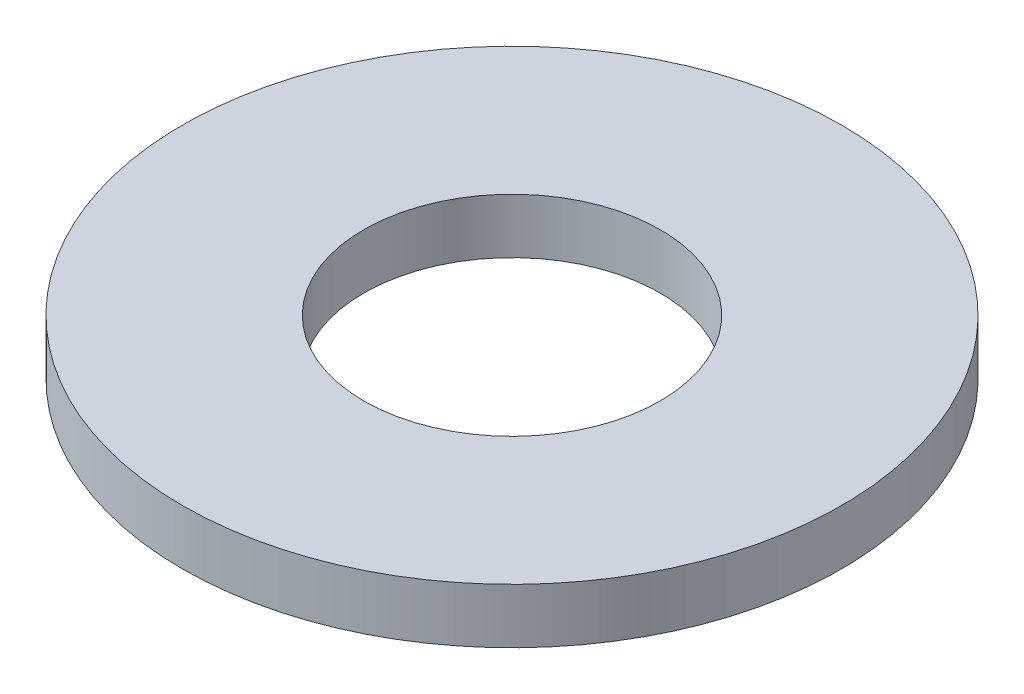
ISO-10303-21;
HEADER;
FILE_DESCRIPTION(('STEP AP214'),'2;1');
FILE_NAME('part.step','',(''),(''),'','','');
FILE_SCHEMA(('AUTOMOTIVE_DESIGN { 1 0 10303 214 1 1 1 1 }'));
ENDSEC;
DATA;
#1=APPLICATION_CONTEXT('core data for automotive mechanical design processes');
#2=APPLICATION_PROTOCOL_DEFINITION('international standard','automotive_design',2000,#1);
#3=PRODUCT_CONTEXT('',#1,'mechanical');
#4=PRODUCT('Part','Part','',(#3));
#5=PRODUCT_RELATED_PRODUCT_CATEGORY('part','',(#4));
#6=PRODUCT_DEFINITION_FORMATION('','',#4);
#7=PRODUCT_DEFINITION_CONTEXT('part definition',#1,'design');
#8=PRODUCT_DEFINITION('design','',#6,#7);
#9=PRODUCT_DEFINITION_SHAPE('','',#8);
#10=(LENGTH_UNIT() NAMED_UNIT(*) SI_UNIT(.MILLI.,.METRE.));
#11=(NAMED_UNIT(*) PLANE_ANGLE_UNIT() SI_UNIT($,.RADIAN.));
#12=(NAMED_UNIT(*) SI_UNIT($,.STERADIAN.) SOLID_ANGLE_UNIT());
#13=UNCERTAINTY_MEASURE_WITH_UNIT(LENGTH_MEASURE(1.E-05),#10,'distance_accuracy_value','');
#14=(GEOMETRIC_REPRESENTATION_CONTEXT(3) GLOBAL_UNCERTAINTY_ASSIGNED_CONTEXT((#13)) GLOBAL_UNIT_ASSIGNED_CONTEXT((#10,
#11,#12)) REPRESENTATION_CONTEXT('',''));
#15=CARTESIAN_POINT('',(0.,0.,0.));
#16=DIRECTION('',(0.,0.,1.));
#17=DIRECTION('',(1.,0.,0.));
#18=AXIS2_PLACEMENT_3D('',#15,#16,#17);
#19=CARTESIAN_POINT('',(0.,0.5,0.));
#20=DIRECTION('',(0.,1.,0.));
#21=DIRECTION('',(0.,0.,1.));
#22=AXIS2_PLACEMENT_3D('',#19,#20,#21);
#23=PLANE('',#22);
#24=CARTESIAN_POINT('',(0.,0.5,0.));
#25=DIRECTION('',(0.,1.,0.));
#26=DIRECTION('',(0.,0.,1.));
#27=AXIS2_PLACEMENT_3D('',#24,#25,#26);
#28=CIRCLE('',#27,3.);
#29=CARTESIAN_POINT('',(0.,0.5,3.));
#30=VERTEX_POINT('',#29);
#31=EDGE_CURVE('E10',#30,#30,#28,.T.);
#32=ORIENTED_EDGE('',*,*,#31,.T.);
#33=EDGE_LOOP('',(#32));
#34=FACE_BOUND('',#33,.T.);
#35=CARTESIAN_POINT('',(0.,0.5,0.));
#36=DIRECTION('',(0.,1.,0.));
#37=DIRECTION('',(0.,0.,1.));
#38=AXIS2_PLACEMENT_3D('',#35,#36,#37);
#39=CIRCLE('',#38,1.35);
#40=CARTESIAN_POINT('',(0.,0.5,1.35));
#41=VERTEX_POINT('',#40);
#42=EDGE_CURVE('E42',#41,#41,#39,.T.);
#43=ORIENTED_EDGE('',*,*,#42,.F.);
#44=EDGE_LOOP('',(#43));
#45=FACE_BOUND('',#44,.T.);
#46=ADVANCED_FACE('F31',(#34,#45),#23,.T.);
#47=CARTESIAN_POINT('',(0.,0.,0.));
#48=DIRECTION('',(0.,1.,0.));
#49=DIRECTION('',(0.,0.,1.));
#50=AXIS2_PLACEMENT_3D('',#47,#48,#49);
#51=PLANE('',#50);
#52=CARTESIAN_POINT('',(0.,0.,0.));
#53=DIRECTION('',(0.,1.,0.));
#54=DIRECTION('',(0.,0.,1.));
#55=AXIS2_PLACEMENT_3D('',#52,#53,#54);
#56=CIRCLE('',#55,3.);
#57=CARTESIAN_POINT('',(0.,0.,3.));
#58=VERTEX_POINT('',#57);
#59=EDGE_CURVE('E35',#58,#58,#56,.T.);
#60=ORIENTED_EDGE('',*,*,#59,.F.);
#61=EDGE_LOOP('',(#60));
#62=FACE_BOUND('',#61,.T.);
#63=CARTESIAN_POINT('',(0.,0.,0.));
#64=DIRECTION('',(0.,1.,0.));
#65=DIRECTION('',(0.,0.,1.));
#66=AXIS2_PLACEMENT_3D('',#63,#64,#65);
#67=CIRCLE('',#66,1.35);
#68=CARTESIAN_POINT('',(0.,0.,1.35));
#69=VERTEX_POINT('',#68);
#70=EDGE_CURVE('E44',#69,#69,#67,.T.);
#71=ORIENTED_EDGE('',*,*,#70,.T.);
#72=EDGE_LOOP('',(#71));
#73=FACE_BOUND('',#72,.T.);
#74=ADVANCED_FACE('F54',(#62,#73),#51,.F.);
#75=CARTESIAN_POINT('',(0.,0.5,0.));
#76=DIRECTION('',(0.,-1.,0.));
#77=DIRECTION('',(0.,0.,-1.));
#78=AXIS2_PLACEMENT_3D('',#75,#76,#77);
#79=CYLINDRICAL_SURFACE('',#78,3.);
#80=ORIENTED_EDGE('',*,*,#31,.F.);
#81=EDGE_LOOP('',(#80));
#82=FACE_BOUND('',#81,.T.);
#83=ORIENTED_EDGE('',*,*,#59,.T.);
#84=EDGE_LOOP('',(#83));
#85=FACE_BOUND('',#84,.T.);
#86=ADVANCED_FACE('F33',(#82,#85),#79,.T.);
#87=CARTESIAN_POINT('',(0.,0.5,0.));
#88=DIRECTION('',(0.,-1.,0.));
#89=DIRECTION('',(0.,0.,-1.));
#90=AXIS2_PLACEMENT_3D('',#87,#88,#89);
#91=CYLINDRICAL_SURFACE('',#90,1.35);
#92=ORIENTED_EDGE('',*,*,#42,.T.);
#93=EDGE_LOOP('',(#92));
#94=FACE_BOUND('',#93,.T.);
#95=ORIENTED_EDGE('',*,*,#70,.F.);
#96=EDGE_LOOP('',(#95));
#97=FACE_BOUND('',#96,.T.);
#98=ADVANCED_FACE('F50',(#94,#97),#91,.F.);
#99=CLOSED_SHELL('',(#46,#74,#86,#98));
#100=MANIFOLD_SOLID_BREP('B2',#99);
#101=ADVANCED_BREP_SHAPE_REPRESENTATION('',(#18,#100),#14);
#102=SHAPE_DEFINITION_REPRESENTATION(#9,#101);
ENDSEC;
END-ISO-10303-21;
